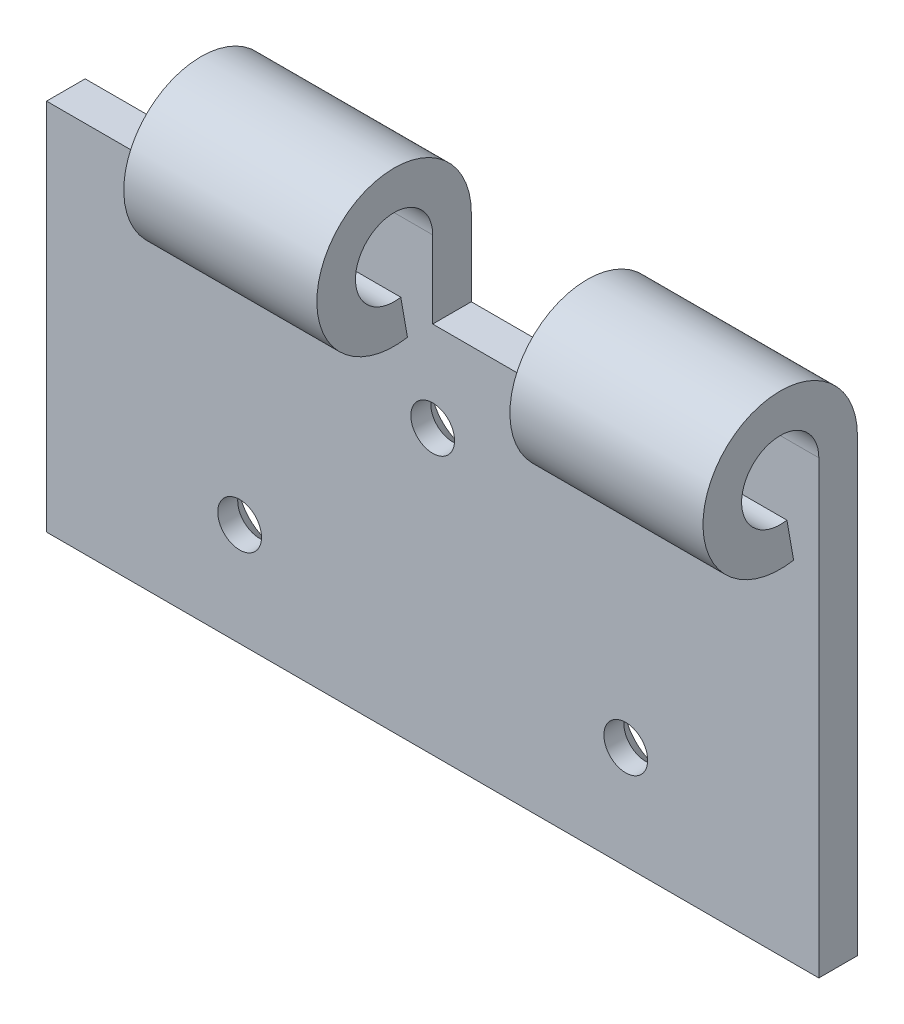
ISO-10303-21;
HEADER;
FILE_DESCRIPTION(('STEP AP214'),'2;1');
FILE_NAME('part.step','',(''),(''),'','','');
FILE_SCHEMA(('AUTOMOTIVE_DESIGN { 1 0 10303 214 1 1 1 1 }'));
ENDSEC;
DATA;
#1=APPLICATION_CONTEXT('core data for automotive mechanical design processes');
#2=APPLICATION_PROTOCOL_DEFINITION('international standard','automotive_design',2000,#1);
#3=PRODUCT_CONTEXT('',#1,'mechanical');
#4=PRODUCT('Part','Part','',(#3));
#5=PRODUCT_RELATED_PRODUCT_CATEGORY('part','',(#4));
#6=PRODUCT_DEFINITION_FORMATION('','',#4);
#7=PRODUCT_DEFINITION_CONTEXT('part definition',#1,'design');
#8=PRODUCT_DEFINITION('design','',#6,#7);
#9=PRODUCT_DEFINITION_SHAPE('','',#8);
#10=(LENGTH_UNIT() NAMED_UNIT(*) SI_UNIT(.MILLI.,.METRE.));
#11=(NAMED_UNIT(*) PLANE_ANGLE_UNIT() SI_UNIT($,.RADIAN.));
#12=(NAMED_UNIT(*) SI_UNIT($,.STERADIAN.) SOLID_ANGLE_UNIT());
#13=UNCERTAINTY_MEASURE_WITH_UNIT(LENGTH_MEASURE(1.E-05),#10,'distance_accuracy_value','');
#14=(GEOMETRIC_REPRESENTATION_CONTEXT(3) GLOBAL_UNCERTAINTY_ASSIGNED_CONTEXT((#13)) GLOBAL_UNIT_ASSIGNED_CONTEXT((#10,
#11,#12)) REPRESENTATION_CONTEXT('',''));
#15=CARTESIAN_POINT('',(0.,0.,0.));
#16=DIRECTION('',(0.,0.,1.));
#17=DIRECTION('',(1.,0.,0.));
#18=AXIS2_PLACEMENT_3D('',#15,#16,#17);
#19=CARTESIAN_POINT('',(0.,0.,3.));
#20=DIRECTION('',(0.,0.,1.));
#21=DIRECTION('',(1.,0.,0.));
#22=AXIS2_PLACEMENT_3D('',#19,#20,#21);
#23=PLANE('',#22);
#24=CARTESIAN_POINT('',(-15.,-9.5,3.));
#25=DIRECTION('',(0.,0.,1.));
#26=DIRECTION('',(1.,0.,0.));
#27=AXIS2_PLACEMENT_3D('',#24,#25,#26);
#28=CIRCLE('',#27,1.7);
#29=CARTESIAN_POINT('',(-13.3,-9.5,3.));
#30=VERTEX_POINT('',#29);
#31=EDGE_CURVE('E375',#30,#30,#28,.F.);
#32=ORIENTED_EDGE('',*,*,#31,.T.);
#33=EDGE_LOOP('',(#32));
#34=FACE_BOUND('',#33,.T.);
#35=DIRECTION('',(1.,0.,0.));
#36=VECTOR('',#35,1.);
#37=CARTESIAN_POINT('',(0.,17.5,3.));
#38=LINE('',#37,#36);
#39=CARTESIAN_POINT('',(15.,17.5,3.));
#40=VERTEX_POINT('',#39);
#41=CARTESIAN_POINT('',(30.,17.5,3.));
#42=VERTEX_POINT('',#41);
#43=EDGE_CURVE('E235',#40,#42,#38,.T.);
#44=ORIENTED_EDGE('',*,*,#43,.F.);
#45=DIRECTION('',(0.,-1.,0.));
#46=VECTOR('',#45,1.);
#47=CARTESIAN_POINT('',(15.,0.,3.));
#48=LINE('',#47,#46);
#49=CARTESIAN_POINT('',(15.,11.5,3.));
#50=VERTEX_POINT('',#49);
#51=EDGE_CURVE('E206',#40,#50,#48,.T.);
#52=ORIENTED_EDGE('',*,*,#51,.T.);
#53=DIRECTION('',(-1.,0.,0.));
#54=VECTOR('',#53,1.);
#55=CARTESIAN_POINT('',(0.,11.5,3.));
#56=LINE('',#55,#54);
#57=CARTESIAN_POINT('',(0.,11.5,3.));
#58=VERTEX_POINT('',#57);
#59=EDGE_CURVE('E169',#50,#58,#56,.T.);
#60=ORIENTED_EDGE('',*,*,#59,.T.);
#61=DIRECTION('',(0.,1.,0.));
#62=VECTOR('',#61,1.);
#63=CARTESIAN_POINT('',(0.,0.,3.));
#64=LINE('',#63,#62);
#65=CARTESIAN_POINT('',(0.,17.5,3.));
#66=VERTEX_POINT('',#65);
#67=EDGE_CURVE('E198',#58,#66,#64,.T.);
#68=ORIENTED_EDGE('',*,*,#67,.T.);
#69=CARTESIAN_POINT('',(-15.,17.5,3.));
#70=VERTEX_POINT('',#69);
#71=EDGE_CURVE('E237',#70,#66,#38,.T.);
#72=ORIENTED_EDGE('',*,*,#71,.F.);
#73=DIRECTION('',(0.,-1.,0.));
#74=VECTOR('',#73,1.);
#75=CARTESIAN_POINT('',(-15.,0.,3.));
#76=LINE('',#75,#74);
#77=CARTESIAN_POINT('',(-15.,11.5,3.));
#78=VERTEX_POINT('',#77);
#79=EDGE_CURVE('E64',#70,#78,#76,.T.);
#80=ORIENTED_EDGE('',*,*,#79,.T.);
#81=DIRECTION('',(-1.,0.,0.));
#82=VECTOR('',#81,1.);
#83=CARTESIAN_POINT('',(0.,11.5,3.));
#84=LINE('',#83,#82);
#85=CARTESIAN_POINT('',(-30.,11.5,3.));
#86=VERTEX_POINT('',#85);
#87=EDGE_CURVE('E208',#78,#86,#84,.T.);
#88=ORIENTED_EDGE('',*,*,#87,.T.);
#89=DIRECTION('',(0.,1.,0.));
#90=VECTOR('',#89,1.);
#91=CARTESIAN_POINT('',(-30.,0.,3.));
#92=LINE('',#91,#90);
#93=CARTESIAN_POINT('',(-30.,-17.5,3.));
#94=VERTEX_POINT('',#93);
#95=EDGE_CURVE('E238',#94,#86,#92,.T.);
#96=ORIENTED_EDGE('',*,*,#95,.F.);
#97=DIRECTION('',(1.,0.,0.));
#98=VECTOR('',#97,1.);
#99=CARTESIAN_POINT('',(0.,-17.5,3.));
#100=LINE('',#99,#98);
#101=CARTESIAN_POINT('',(30.,-17.5,3.));
#102=VERTEX_POINT('',#101);
#103=EDGE_CURVE('E228',#94,#102,#100,.T.);
#104=ORIENTED_EDGE('',*,*,#103,.T.);
#105=DIRECTION('',(0.,1.,0.));
#106=VECTOR('',#105,1.);
#107=CARTESIAN_POINT('',(30.,0.,3.));
#108=LINE('',#107,#106);
#109=EDGE_CURVE('E231',#102,#42,#108,.T.);
#110=ORIENTED_EDGE('',*,*,#109,.T.);
#111=EDGE_LOOP('',(#44,#52,#60,#68,#72,#80,#88,#96,#104,#110));
#112=FACE_BOUND('',#111,.T.);
#113=CARTESIAN_POINT('',(15.,-9.5,3.));
#114=DIRECTION('',(0.,0.,1.));
#115=DIRECTION('',(1.,0.,0.));
#116=AXIS2_PLACEMENT_3D('',#113,#114,#115);
#117=CIRCLE('',#116,1.7);
#118=CARTESIAN_POINT('',(16.7,-9.5,3.));
#119=VERTEX_POINT('',#118);
#120=EDGE_CURVE('E389',#119,#119,#117,.F.);
#121=ORIENTED_EDGE('',*,*,#120,.T.);
#122=EDGE_LOOP('',(#121));
#123=FACE_BOUND('',#122,.T.);
#124=CARTESIAN_POINT('',(0.,4.5,3.));
#125=DIRECTION('',(0.,0.,1.));
#126=DIRECTION('',(1.,0.,0.));
#127=AXIS2_PLACEMENT_3D('',#124,#125,#126);
#128=CIRCLE('',#127,1.7);
#129=CARTESIAN_POINT('',(1.7,4.5,3.));
#130=VERTEX_POINT('',#129);
#131=EDGE_CURVE('E368',#130,#130,#128,.F.);
#132=ORIENTED_EDGE('',*,*,#131,.T.);
#133=EDGE_LOOP('',(#132));
#134=FACE_BOUND('',#133,.T.);
#135=ADVANCED_FACE('F49',(#34,#112,#123,#134),#23,.T.);
#136=CARTESIAN_POINT('',(0.,0.,0.));
#137=DIRECTION('',(0.,0.,1.));
#138=DIRECTION('',(1.,0.,0.));
#139=AXIS2_PLACEMENT_3D('',#136,#137,#138);
#140=PLANE('',#139);
#141=CARTESIAN_POINT('',(0.,4.5,0.));
#142=DIRECTION('',(0.,0.,-1.));
#143=DIRECTION('',(-1.,0.,0.));
#144=AXIS2_PLACEMENT_3D('',#141,#142,#143);
#145=CIRCLE('',#144,3.15);
#146=CARTESIAN_POINT('',(-3.15,4.5,0.));
#147=VERTEX_POINT('',#146);
#148=EDGE_CURVE('E377',#147,#147,#145,.T.);
#149=ORIENTED_EDGE('',*,*,#148,.F.);
#150=EDGE_LOOP('',(#149));
#151=FACE_BOUND('',#150,.T.);
#152=CARTESIAN_POINT('',(-15.,-9.5,0.));
#153=DIRECTION('',(0.,0.,-1.));
#154=DIRECTION('',(-1.,0.,0.));
#155=AXIS2_PLACEMENT_3D('',#152,#153,#154);
#156=CIRCLE('',#155,3.15);
#157=CARTESIAN_POINT('',(-18.15,-9.5,0.));
#158=VERTEX_POINT('',#157);
#159=EDGE_CURVE('E372',#158,#158,#156,.T.);
#160=ORIENTED_EDGE('',*,*,#159,.F.);
#161=EDGE_LOOP('',(#160));
#162=FACE_BOUND('',#161,.T.);
#163=DIRECTION('',(0.,-1.,0.));
#164=VECTOR('',#163,1.);
#165=CARTESIAN_POINT('',(15.,23.5,0.));
#166=LINE('',#165,#164);
#167=CARTESIAN_POINT('',(15.,17.5,0.));
#168=VERTEX_POINT('',#167);
#169=CARTESIAN_POINT('',(15.,11.5,0.));
#170=VERTEX_POINT('',#169);
#171=EDGE_CURVE('E151',#168,#170,#166,.T.);
#172=ORIENTED_EDGE('',*,*,#171,.F.);
#173=DIRECTION('',(1.,0.,0.));
#174=VECTOR('',#173,1.);
#175=CARTESIAN_POINT('',(0.,17.5,0.));
#176=LINE('',#175,#174);
#177=CARTESIAN_POINT('',(30.,17.5,0.));
#178=VERTEX_POINT('',#177);
#179=EDGE_CURVE('E248',#168,#178,#176,.T.);
#180=ORIENTED_EDGE('',*,*,#179,.T.);
#181=DIRECTION('',(0.,1.,0.));
#182=VECTOR('',#181,1.);
#183=CARTESIAN_POINT('',(30.,0.,0.));
#184=LINE('',#183,#182);
#185=CARTESIAN_POINT('',(30.,-17.5,0.));
#186=VERTEX_POINT('',#185);
#187=EDGE_CURVE('E245',#186,#178,#184,.T.);
#188=ORIENTED_EDGE('',*,*,#187,.F.);
#189=DIRECTION('',(1.,0.,0.));
#190=VECTOR('',#189,1.);
#191=CARTESIAN_POINT('',(0.,-17.5,0.));
#192=LINE('',#191,#190);
#193=CARTESIAN_POINT('',(-30.,-17.5,0.));
#194=VERTEX_POINT('',#193);
#195=EDGE_CURVE('E242',#194,#186,#192,.T.);
#196=ORIENTED_EDGE('',*,*,#195,.F.);
#197=DIRECTION('',(0.,1.,0.));
#198=VECTOR('',#197,1.);
#199=CARTESIAN_POINT('',(-30.,0.,0.));
#200=LINE('',#199,#198);
#201=CARTESIAN_POINT('',(-30.,11.5,0.));
#202=VERTEX_POINT('',#201);
#203=EDGE_CURVE('E232',#194,#202,#200,.T.);
#204=ORIENTED_EDGE('',*,*,#203,.T.);
#205=DIRECTION('',(-1.,0.,0.));
#206=VECTOR('',#205,1.);
#207=CARTESIAN_POINT('',(-15.,11.5,0.));
#208=LINE('',#207,#206);
#209=CARTESIAN_POINT('',(-15.,11.5,0.));
#210=VERTEX_POINT('',#209);
#211=EDGE_CURVE('E186',#210,#202,#208,.T.);
#212=ORIENTED_EDGE('',*,*,#211,.F.);
#213=DIRECTION('',(0.,-1.,0.));
#214=VECTOR('',#213,1.);
#215=CARTESIAN_POINT('',(-15.,23.5,0.));
#216=LINE('',#215,#214);
#217=CARTESIAN_POINT('',(-15.,17.5,0.));
#218=VERTEX_POINT('',#217);
#219=EDGE_CURVE('E184',#218,#210,#216,.T.);
#220=ORIENTED_EDGE('',*,*,#219,.F.);
#221=CARTESIAN_POINT('',(0.,17.5,0.));
#222=VERTEX_POINT('',#221);
#223=EDGE_CURVE('E250',#218,#222,#176,.T.);
#224=ORIENTED_EDGE('',*,*,#223,.T.);
#225=DIRECTION('',(0.,1.,0.));
#226=VECTOR('',#225,1.);
#227=CARTESIAN_POINT('',(0.,23.5,0.));
#228=LINE('',#227,#226);
#229=CARTESIAN_POINT('',(0.,11.5,0.));
#230=VERTEX_POINT('',#229);
#231=EDGE_CURVE('E178',#230,#222,#228,.T.);
#232=ORIENTED_EDGE('',*,*,#231,.F.);
#233=DIRECTION('',(-1.,0.,0.));
#234=VECTOR('',#233,1.);
#235=CARTESIAN_POINT('',(15.,11.5,0.));
#236=LINE('',#235,#234);
#237=EDGE_CURVE('E161',#170,#230,#236,.T.);
#238=ORIENTED_EDGE('',*,*,#237,.F.);
#239=EDGE_LOOP('',(#172,#180,#188,#196,#204,#212,#220,#224,#232,#238));
#240=FACE_BOUND('',#239,.T.);
#241=CARTESIAN_POINT('',(15.,-9.5,0.));
#242=DIRECTION('',(0.,0.,-1.));
#243=DIRECTION('',(-1.,0.,0.));
#244=AXIS2_PLACEMENT_3D('',#241,#242,#243);
#245=CIRCLE('',#244,3.15);
#246=CARTESIAN_POINT('',(11.85,-9.5,0.));
#247=VERTEX_POINT('',#246);
#248=EDGE_CURVE('E384',#247,#247,#245,.T.);
#249=ORIENTED_EDGE('',*,*,#248,.F.);
#250=EDGE_LOOP('',(#249));
#251=FACE_BOUND('',#250,.T.);
#252=ADVANCED_FACE('F174',(#151,#162,#240,#251),#140,.F.);
#253=CARTESIAN_POINT('',(-30.,0.,3.));
#254=DIRECTION('',(-1.,0.,0.));
#255=DIRECTION('',(0.,0.,1.));
#256=AXIS2_PLACEMENT_3D('',#253,#254,#255);
#257=PLANE('',#256);
#258=ORIENTED_EDGE('',*,*,#95,.T.);
#259=DIRECTION('',(0.,0.,1.));
#260=VECTOR('',#259,1.);
#261=CARTESIAN_POINT('',(-30.,11.5,0.));
#262=LINE('',#261,#260);
#263=EDGE_CURVE('E189',#202,#86,#262,.T.);
#264=ORIENTED_EDGE('',*,*,#263,.F.);
#265=ORIENTED_EDGE('',*,*,#203,.F.);
#266=DIRECTION('',(0.,0.,-1.));
#267=VECTOR('',#266,1.);
#268=CARTESIAN_POINT('',(-30.,-17.5,3.));
#269=LINE('',#268,#267);
#270=EDGE_CURVE('E241',#94,#194,#269,.T.);
#271=ORIENTED_EDGE('',*,*,#270,.F.);
#272=EDGE_LOOP('',(#258,#264,#265,#271));
#273=FACE_BOUND('',#272,.T.);
#274=ADVANCED_FACE('F289',(#273),#257,.T.);
#275=CARTESIAN_POINT('',(-46.9705627484771,17.5,6.));
#276=DIRECTION('',(1.,0.,0.));
#277=DIRECTION('',(0.,0.,-1.));
#278=AXIS2_PLACEMENT_3D('',#275,#276,#277);
#279=CYLINDRICAL_SURFACE('',#278,6.);
#280=ORIENTED_EDGE('',*,*,#179,.F.);
#281=CARTESIAN_POINT('',(15.,17.5,6.));
#282=DIRECTION('',(-1.,0.,0.));
#283=DIRECTION('',(0.,-1.,0.));
#284=AXIS2_PLACEMENT_3D('',#281,#282,#283);
#285=CIRCLE('',#284,6.);
#286=CARTESIAN_POINT('',(15.,11.5911534819268,4.95811093399839));
#287=VERTEX_POINT('',#286);
#288=EDGE_CURVE('E157',#168,#287,#285,.F.);
#289=ORIENTED_EDGE('',*,*,#288,.T.);
#290=DIRECTION('',(1.,0.,0.));
#291=VECTOR('',#290,1.);
#292=CARTESIAN_POINT('',(-46.9705627484771,11.5911534819268,4.95811093399839));
#293=LINE('',#292,#291);
#294=CARTESIAN_POINT('',(30.,11.5911534819268,4.95811093399839));
#295=VERTEX_POINT('',#294);
#296=EDGE_CURVE('E225',#287,#295,#293,.T.);
#297=ORIENTED_EDGE('',*,*,#296,.T.);
#298=CARTESIAN_POINT('',(30.,17.5,6.));
#299=DIRECTION('',(1.,0.,0.));
#300=DIRECTION('',(0.,0.,-1.));
#301=AXIS2_PLACEMENT_3D('',#298,#299,#300);
#302=CIRCLE('',#301,6.);
#303=EDGE_CURVE('E213',#178,#295,#302,.T.);
#304=ORIENTED_EDGE('',*,*,#303,.F.);
#305=EDGE_LOOP('',(#280,#289,#297,#304));
#306=FACE_BOUND('',#305,.T.);
#307=ADVANCED_FACE('F281',(#306),#279,.T.);
#308=CARTESIAN_POINT('',(-15.,11.5911534819268,4.95811093399839));
#309=VERTEX_POINT('',#308);
#310=CARTESIAN_POINT('',(0.,11.5911534819268,4.95811093399839));
#311=VERTEX_POINT('',#310);
#312=EDGE_CURVE('E227',#309,#311,#293,.T.);
#313=ORIENTED_EDGE('',*,*,#312,.T.);
#314=CARTESIAN_POINT('',(0.,17.5,6.));
#315=DIRECTION('',(1.,0.,0.));
#316=DIRECTION('',(0.,1.,0.));
#317=AXIS2_PLACEMENT_3D('',#314,#315,#316);
#318=CIRCLE('',#317,6.);
#319=EDGE_CURVE('E199',#311,#222,#318,.F.);
#320=ORIENTED_EDGE('',*,*,#319,.T.);
#321=ORIENTED_EDGE('',*,*,#223,.F.);
#322=CARTESIAN_POINT('',(-15.,17.5,6.));
#323=DIRECTION('',(-1.,0.,0.));
#324=DIRECTION('',(0.,-1.,0.));
#325=AXIS2_PLACEMENT_3D('',#322,#323,#324);
#326=CIRCLE('',#325,6.);
#327=EDGE_CURVE('E194',#218,#309,#326,.F.);
#328=ORIENTED_EDGE('',*,*,#327,.T.);
#329=EDGE_LOOP('',(#313,#320,#321,#328));
#330=FACE_BOUND('',#329,.T.);
#331=ADVANCED_FACE('F278',(#330),#279,.T.);
#332=CARTESIAN_POINT('',(-46.9705627484771,14.5455767409634,5.47905546699919));
#333=DIRECTION('',(0.,0.173648177666934,-0.984807753012207));
#334=DIRECTION('',(0.,0.984807753012207,0.173648177666934));
#335=AXIS2_PLACEMENT_3D('',#332,#333,#334);
#336=PLANE('',#335);
#337=ORIENTED_EDGE('',*,*,#296,.F.);
#338=DIRECTION('',(0.,0.984807753012207,0.173648177666934));
#339=VECTOR('',#338,1.);
#340=CARTESIAN_POINT('',(15.,14.5455767409634,5.47905546699919));
#341=LINE('',#340,#339);
#342=CARTESIAN_POINT('',(15.,14.5455767409634,5.47905546699919));
#343=VERTEX_POINT('',#342);
#344=EDGE_CURVE('E201',#287,#343,#341,.T.);
#345=ORIENTED_EDGE('',*,*,#344,.T.);
#346=DIRECTION('',(1.,0.,0.));
#347=VECTOR('',#346,1.);
#348=CARTESIAN_POINT('',(-46.9705627484771,14.5455767409634,5.47905546699919));
#349=LINE('',#348,#347);
#350=CARTESIAN_POINT('',(30.,14.5455767409634,5.47905546699919));
#351=VERTEX_POINT('',#350);
#352=EDGE_CURVE('E217',#343,#351,#349,.T.);
#353=ORIENTED_EDGE('',*,*,#352,.T.);
#354=DIRECTION('',(0.,0.984807753012207,0.173648177666934));
#355=VECTOR('',#354,1.);
#356=CARTESIAN_POINT('',(30.,14.5455767409634,5.47905546699919));
#357=LINE('',#356,#355);
#358=EDGE_CURVE('E218',#295,#351,#357,.T.);
#359=ORIENTED_EDGE('',*,*,#358,.F.);
#360=EDGE_LOOP('',(#337,#345,#353,#359));
#361=FACE_BOUND('',#360,.T.);
#362=ADVANCED_FACE('F280',(#361),#336,.T.);
#363=CARTESIAN_POINT('',(-15.,14.5455767409634,5.47905546699919));
#364=VERTEX_POINT('',#363);
#365=CARTESIAN_POINT('',(0.,14.5455767409634,5.47905546699919));
#366=VERTEX_POINT('',#365);
#367=EDGE_CURVE('E224',#364,#366,#349,.T.);
#368=ORIENTED_EDGE('',*,*,#367,.T.);
#369=DIRECTION('',(0.,-0.984807753012207,-0.173648177666934));
#370=VECTOR('',#369,1.);
#371=CARTESIAN_POINT('',(0.,14.5455767409634,5.47905546699919));
#372=LINE('',#371,#370);
#373=EDGE_CURVE('E72',#366,#311,#372,.T.);
#374=ORIENTED_EDGE('',*,*,#373,.T.);
#375=ORIENTED_EDGE('',*,*,#312,.F.);
#376=DIRECTION('',(0.,0.984807753012207,0.173648177666934));
#377=VECTOR('',#376,1.);
#378=CARTESIAN_POINT('',(-15.,14.5455767409634,5.47905546699919));
#379=LINE('',#378,#377);
#380=EDGE_CURVE('E170',#309,#364,#379,.T.);
#381=ORIENTED_EDGE('',*,*,#380,.T.);
#382=EDGE_LOOP('',(#368,#374,#375,#381));
#383=FACE_BOUND('',#382,.T.);
#384=ADVANCED_FACE('F265',(#383),#336,.T.);
#385=CARTESIAN_POINT('',(-46.9705627484771,17.5,6.));
#386=DIRECTION('',(1.,0.,0.));
#387=DIRECTION('',(0.,0.,-1.));
#388=AXIS2_PLACEMENT_3D('',#385,#386,#387);
#389=CYLINDRICAL_SURFACE('',#388,3.);
#390=ORIENTED_EDGE('',*,*,#352,.F.);
#391=CARTESIAN_POINT('',(15.,17.5,6.));
#392=DIRECTION('',(-1.,0.,0.));
#393=DIRECTION('',(0.,-1.,0.));
#394=AXIS2_PLACEMENT_3D('',#391,#392,#393);
#395=CIRCLE('',#394,3.);
#396=EDGE_CURVE('E11',#343,#40,#395,.T.);
#397=ORIENTED_EDGE('',*,*,#396,.T.);
#398=ORIENTED_EDGE('',*,*,#43,.T.);
#399=CARTESIAN_POINT('',(30.,17.5,6.));
#400=DIRECTION('',(-1.,0.,0.));
#401=DIRECTION('',(0.,0.,-1.));
#402=AXIS2_PLACEMENT_3D('',#399,#400,#401);
#403=CIRCLE('',#402,3.);
#404=EDGE_CURVE('E214',#351,#42,#403,.T.);
#405=ORIENTED_EDGE('',*,*,#404,.F.);
#406=EDGE_LOOP('',(#390,#397,#398,#405));
#407=FACE_BOUND('',#406,.T.);
#408=ADVANCED_FACE('F324',(#407),#389,.F.);
#409=ORIENTED_EDGE('',*,*,#71,.T.);
#410=CARTESIAN_POINT('',(0.,17.5,6.));
#411=DIRECTION('',(1.,0.,0.));
#412=DIRECTION('',(0.,1.,0.));
#413=AXIS2_PLACEMENT_3D('',#410,#411,#412);
#414=CIRCLE('',#413,3.);
#415=EDGE_CURVE('E57',#66,#366,#414,.T.);
#416=ORIENTED_EDGE('',*,*,#415,.T.);
#417=ORIENTED_EDGE('',*,*,#367,.F.);
#418=CARTESIAN_POINT('',(-15.,17.5,6.));
#419=DIRECTION('',(-1.,0.,0.));
#420=DIRECTION('',(0.,-1.,0.));
#421=AXIS2_PLACEMENT_3D('',#418,#419,#420);
#422=CIRCLE('',#421,3.);
#423=EDGE_CURVE('E257',#364,#70,#422,.T.);
#424=ORIENTED_EDGE('',*,*,#423,.T.);
#425=EDGE_LOOP('',(#409,#416,#417,#424));
#426=FACE_BOUND('',#425,.T.);
#427=ADVANCED_FACE('F262',(#426),#389,.F.);
#428=CARTESIAN_POINT('',(0.,-17.5,3.));
#429=DIRECTION('',(0.,1.,0.));
#430=DIRECTION('',(0.,0.,1.));
#431=AXIS2_PLACEMENT_3D('',#428,#429,#430);
#432=PLANE('',#431);
#433=ORIENTED_EDGE('',*,*,#195,.T.);
#434=DIRECTION('',(0.,0.,-1.));
#435=VECTOR('',#434,1.);
#436=CARTESIAN_POINT('',(30.,-17.5,3.));
#437=LINE('',#436,#435);
#438=EDGE_CURVE('E254',#102,#186,#437,.T.);
#439=ORIENTED_EDGE('',*,*,#438,.F.);
#440=ORIENTED_EDGE('',*,*,#103,.F.);
#441=ORIENTED_EDGE('',*,*,#270,.T.);
#442=EDGE_LOOP('',(#433,#439,#440,#441));
#443=FACE_BOUND('',#442,.T.);
#444=ADVANCED_FACE('F51',(#443),#432,.F.);
#445=CARTESIAN_POINT('',(30.,0.,3.));
#446=DIRECTION('',(-1.,0.,0.));
#447=DIRECTION('',(0.,0.,1.));
#448=AXIS2_PLACEMENT_3D('',#445,#446,#447);
#449=PLANE('',#448);
#450=ORIENTED_EDGE('',*,*,#187,.T.);
#451=ORIENTED_EDGE('',*,*,#303,.T.);
#452=ORIENTED_EDGE('',*,*,#358,.T.);
#453=ORIENTED_EDGE('',*,*,#404,.T.);
#454=ORIENTED_EDGE('',*,*,#109,.F.);
#455=ORIENTED_EDGE('',*,*,#438,.T.);
#456=EDGE_LOOP('',(#450,#451,#452,#453,#454,#455));
#457=FACE_BOUND('',#456,.T.);
#458=ADVANCED_FACE('F306',(#457),#449,.F.);
#459=CARTESIAN_POINT('',(-15.,23.5,0.));
#460=DIRECTION('',(-1.,0.,0.));
#461=DIRECTION('',(0.,-1.,0.));
#462=AXIS2_PLACEMENT_3D('',#459,#460,#461);
#463=PLANE('',#462);
#464=ORIENTED_EDGE('',*,*,#219,.T.);
#465=DIRECTION('',(0.,0.,1.));
#466=VECTOR('',#465,1.);
#467=CARTESIAN_POINT('',(-15.,11.5,0.));
#468=LINE('',#467,#466);
#469=EDGE_CURVE('E162',#210,#78,#468,.T.);
#470=ORIENTED_EDGE('',*,*,#469,.T.);
#471=ORIENTED_EDGE('',*,*,#79,.F.);
#472=ORIENTED_EDGE('',*,*,#423,.F.);
#473=ORIENTED_EDGE('',*,*,#380,.F.);
#474=ORIENTED_EDGE('',*,*,#327,.F.);
#475=EDGE_LOOP('',(#464,#470,#471,#472,#473,#474));
#476=FACE_BOUND('',#475,.T.);
#477=ADVANCED_FACE('F269',(#476),#463,.T.);
#478=CARTESIAN_POINT('',(-15.,11.5,0.));
#479=DIRECTION('',(0.,1.,0.));
#480=DIRECTION('',(0.,0.,1.));
#481=AXIS2_PLACEMENT_3D('',#478,#479,#480);
#482=PLANE('',#481);
#483=ORIENTED_EDGE('',*,*,#469,.F.);
#484=ORIENTED_EDGE('',*,*,#211,.T.);
#485=ORIENTED_EDGE('',*,*,#263,.T.);
#486=ORIENTED_EDGE('',*,*,#87,.F.);
#487=EDGE_LOOP('',(#483,#484,#485,#486));
#488=FACE_BOUND('',#487,.T.);
#489=ADVANCED_FACE('F313',(#488),#482,.T.);
#490=CARTESIAN_POINT('',(15.,23.5,0.));
#491=DIRECTION('',(-1.,0.,0.));
#492=DIRECTION('',(0.,-1.,0.));
#493=AXIS2_PLACEMENT_3D('',#490,#491,#492);
#494=PLANE('',#493);
#495=ORIENTED_EDGE('',*,*,#171,.T.);
#496=DIRECTION('',(0.,0.,1.));
#497=VECTOR('',#496,1.);
#498=CARTESIAN_POINT('',(15.,11.5,0.));
#499=LINE('',#498,#497);
#500=EDGE_CURVE('E154',#170,#50,#499,.T.);
#501=ORIENTED_EDGE('',*,*,#500,.T.);
#502=ORIENTED_EDGE('',*,*,#51,.F.);
#503=ORIENTED_EDGE('',*,*,#396,.F.);
#504=ORIENTED_EDGE('',*,*,#344,.F.);
#505=ORIENTED_EDGE('',*,*,#288,.F.);
#506=EDGE_LOOP('',(#495,#501,#502,#503,#504,#505));
#507=FACE_BOUND('',#506,.T.);
#508=ADVANCED_FACE('F153',(#507),#494,.T.);
#509=CARTESIAN_POINT('',(15.,11.5,0.));
#510=DIRECTION('',(0.,1.,0.));
#511=DIRECTION('',(0.,0.,1.));
#512=AXIS2_PLACEMENT_3D('',#509,#510,#511);
#513=PLANE('',#512);
#514=ORIENTED_EDGE('',*,*,#500,.F.);
#515=ORIENTED_EDGE('',*,*,#237,.T.);
#516=DIRECTION('',(0.,0.,1.));
#517=VECTOR('',#516,1.);
#518=CARTESIAN_POINT('',(0.,11.5,0.));
#519=LINE('',#518,#517);
#520=EDGE_CURVE('E171',#230,#58,#519,.T.);
#521=ORIENTED_EDGE('',*,*,#520,.T.);
#522=ORIENTED_EDGE('',*,*,#59,.F.);
#523=EDGE_LOOP('',(#514,#515,#521,#522));
#524=FACE_BOUND('',#523,.T.);
#525=ADVANCED_FACE('F165',(#524),#513,.T.);
#526=CARTESIAN_POINT('',(0.,23.5,0.));
#527=DIRECTION('',(1.,0.,0.));
#528=DIRECTION('',(0.,1.,0.));
#529=AXIS2_PLACEMENT_3D('',#526,#527,#528);
#530=PLANE('',#529);
#531=ORIENTED_EDGE('',*,*,#319,.F.);
#532=ORIENTED_EDGE('',*,*,#373,.F.);
#533=ORIENTED_EDGE('',*,*,#415,.F.);
#534=ORIENTED_EDGE('',*,*,#67,.F.);
#535=ORIENTED_EDGE('',*,*,#520,.F.);
#536=ORIENTED_EDGE('',*,*,#231,.T.);
#537=EDGE_LOOP('',(#531,#532,#533,#534,#535,#536));
#538=FACE_BOUND('',#537,.T.);
#539=ADVANCED_FACE('F274',(#538),#530,.T.);
#540=CARTESIAN_POINT('',(15.,-9.5,0.));
#541=DIRECTION('',(0.,0.,-1.));
#542=DIRECTION('',(-1.,0.,0.));
#543=AXIS2_PLACEMENT_3D('',#540,#541,#542);
#544=CYLINDRICAL_SURFACE('',#543,1.7);
#545=ORIENTED_EDGE('',*,*,#120,.F.);
#546=EDGE_LOOP('',(#545));
#547=FACE_BOUND('',#546,.T.);
#548=CARTESIAN_POINT('',(15.,-9.5,1.45));
#549=DIRECTION('',(0.,0.,-1.));
#550=DIRECTION('',(-1.,0.,0.));
#551=AXIS2_PLACEMENT_3D('',#548,#549,#550);
#552=CIRCLE('',#551,1.7);
#553=CARTESIAN_POINT('',(13.3,-9.5,1.45));
#554=VERTEX_POINT('',#553);
#555=EDGE_CURVE('E187',#554,#554,#552,.T.);
#556=ORIENTED_EDGE('',*,*,#555,.T.);
#557=EDGE_LOOP('',(#556));
#558=FACE_BOUND('',#557,.T.);
#559=ADVANCED_FACE('F340',(#547,#558),#544,.F.);
#560=CARTESIAN_POINT('',(15.,-9.5,0.));
#561=DIRECTION('',(0.,0.,-1.));
#562=DIRECTION('',(-1.,0.,0.));
#563=AXIS2_PLACEMENT_3D('',#560,#561,#562);
#564=CONICAL_SURFACE('',#563,3.15,0.785398163397449);
#565=ORIENTED_EDGE('',*,*,#555,.F.);
#566=EDGE_LOOP('',(#565));
#567=FACE_BOUND('',#566,.T.);
#568=ORIENTED_EDGE('',*,*,#248,.T.);
#569=EDGE_LOOP('',(#568));
#570=FACE_BOUND('',#569,.T.);
#571=ADVANCED_FACE('F341',(#567,#570),#564,.F.);
#572=CARTESIAN_POINT('',(-15.,-9.5,0.));
#573=DIRECTION('',(0.,0.,-1.));
#574=DIRECTION('',(-1.,0.,0.));
#575=AXIS2_PLACEMENT_3D('',#572,#573,#574);
#576=CYLINDRICAL_SURFACE('',#575,1.7);
#577=ORIENTED_EDGE('',*,*,#31,.F.);
#578=EDGE_LOOP('',(#577));
#579=FACE_BOUND('',#578,.T.);
#580=CARTESIAN_POINT('',(-15.,-9.5,1.45));
#581=DIRECTION('',(0.,0.,-1.));
#582=DIRECTION('',(-1.,0.,0.));
#583=AXIS2_PLACEMENT_3D('',#580,#581,#582);
#584=CIRCLE('',#583,1.7);
#585=CARTESIAN_POINT('',(-16.7,-9.5,1.45));
#586=VERTEX_POINT('',#585);
#587=EDGE_CURVE('E382',#586,#586,#584,.T.);
#588=ORIENTED_EDGE('',*,*,#587,.T.);
#589=EDGE_LOOP('',(#588));
#590=FACE_BOUND('',#589,.T.);
#591=ADVANCED_FACE('F344',(#579,#590),#576,.F.);
#592=CARTESIAN_POINT('',(-15.,-9.5,0.));
#593=DIRECTION('',(0.,0.,-1.));
#594=DIRECTION('',(-1.,0.,0.));
#595=AXIS2_PLACEMENT_3D('',#592,#593,#594);
#596=CONICAL_SURFACE('',#595,3.15,0.785398163397448);
#597=ORIENTED_EDGE('',*,*,#587,.F.);
#598=EDGE_LOOP('',(#597));
#599=FACE_BOUND('',#598,.T.);
#600=ORIENTED_EDGE('',*,*,#159,.T.);
#601=EDGE_LOOP('',(#600));
#602=FACE_BOUND('',#601,.T.);
#603=ADVANCED_FACE('F349',(#599,#602),#596,.F.);
#604=CARTESIAN_POINT('',(0.,4.5,0.));
#605=DIRECTION('',(0.,0.,-1.));
#606=DIRECTION('',(-1.,0.,0.));
#607=AXIS2_PLACEMENT_3D('',#604,#605,#606);
#608=CYLINDRICAL_SURFACE('',#607,1.7);
#609=ORIENTED_EDGE('',*,*,#131,.F.);
#610=EDGE_LOOP('',(#609));
#611=FACE_BOUND('',#610,.T.);
#612=CARTESIAN_POINT('',(0.,4.5,1.45));
#613=DIRECTION('',(0.,0.,-1.));
#614=DIRECTION('',(-1.,0.,0.));
#615=AXIS2_PLACEMENT_3D('',#612,#613,#614);
#616=CIRCLE('',#615,1.7);
#617=CARTESIAN_POINT('',(-1.7,4.5,1.45));
#618=VERTEX_POINT('',#617);
#619=EDGE_CURVE('E371',#618,#618,#616,.T.);
#620=ORIENTED_EDGE('',*,*,#619,.T.);
#621=EDGE_LOOP('',(#620));
#622=FACE_BOUND('',#621,.T.);
#623=ADVANCED_FACE('F352',(#611,#622),#608,.F.);
#624=CARTESIAN_POINT('',(0.,4.5,0.));
#625=DIRECTION('',(0.,0.,-1.));
#626=DIRECTION('',(-1.,0.,0.));
#627=AXIS2_PLACEMENT_3D('',#624,#625,#626);
#628=CONICAL_SURFACE('',#627,3.15,0.785398163397448);
#629=ORIENTED_EDGE('',*,*,#619,.F.);
#630=EDGE_LOOP('',(#629));
#631=FACE_BOUND('',#630,.T.);
#632=ORIENTED_EDGE('',*,*,#148,.T.);
#633=EDGE_LOOP('',(#632));
#634=FACE_BOUND('',#633,.T.);
#635=ADVANCED_FACE('F357',(#631,#634),#628,.F.);
#636=CLOSED_SHELL('',(#135,#252,#274,#307,#331,#362,#384,#408,#427,#444,#458,#477,#489,#508,
#525,#539,#559,#571,#591,#603,#623,#635));
#637=MANIFOLD_SOLID_BREP('B2',#636);
#638=ADVANCED_BREP_SHAPE_REPRESENTATION('',(#18,#637),#14);
#639=SHAPE_DEFINITION_REPRESENTATION(#9,#638);
ENDSEC;
END-ISO-10303-21;
